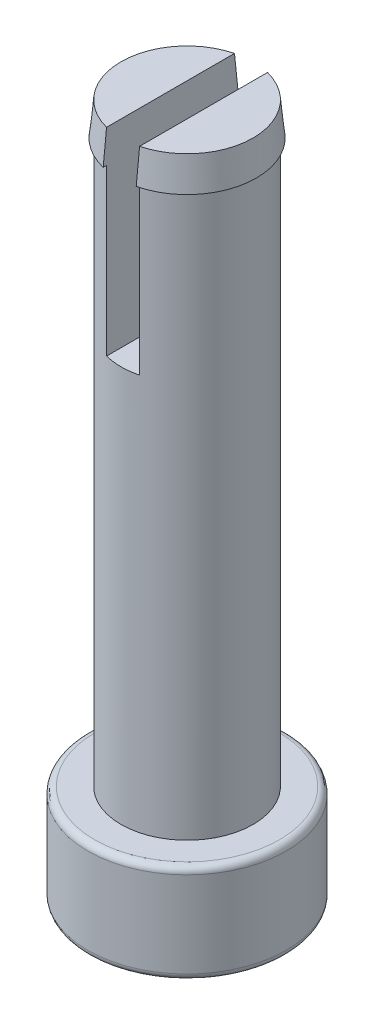
ISO-10303-21;
HEADER;
FILE_DESCRIPTION(('STEP AP214'),'2;1');
FILE_NAME('part.step','',(''),(''),'','','');
FILE_SCHEMA(('AUTOMOTIVE_DESIGN { 1 0 10303 214 1 1 1 1 }'));
ENDSEC;
DATA;
#1=APPLICATION_CONTEXT('core data for automotive mechanical design processes');
#2=APPLICATION_PROTOCOL_DEFINITION('international standard','automotive_design',2000,#1);
#3=PRODUCT_CONTEXT('',#1,'mechanical');
#4=PRODUCT('Part','Part','',(#3));
#5=PRODUCT_RELATED_PRODUCT_CATEGORY('part','',(#4));
#6=PRODUCT_DEFINITION_FORMATION('','',#4);
#7=PRODUCT_DEFINITION_CONTEXT('part definition',#1,'design');
#8=PRODUCT_DEFINITION('design','',#6,#7);
#9=PRODUCT_DEFINITION_SHAPE('','',#8);
#10=(LENGTH_UNIT() NAMED_UNIT(*) SI_UNIT(.MILLI.,.METRE.));
#11=(NAMED_UNIT(*) PLANE_ANGLE_UNIT() SI_UNIT($,.RADIAN.));
#12=(NAMED_UNIT(*) SI_UNIT($,.STERADIAN.) SOLID_ANGLE_UNIT());
#13=UNCERTAINTY_MEASURE_WITH_UNIT(LENGTH_MEASURE(1.E-05),#10,'distance_accuracy_value','');
#14=(GEOMETRIC_REPRESENTATION_CONTEXT(3) GLOBAL_UNCERTAINTY_ASSIGNED_CONTEXT((#13)) GLOBAL_UNIT_ASSIGNED_CONTEXT((#10,
#11,#12)) REPRESENTATION_CONTEXT('',''));
#15=CARTESIAN_POINT('',(0.,0.,0.));
#16=DIRECTION('',(0.,0.,1.));
#17=DIRECTION('',(1.,0.,0.));
#18=AXIS2_PLACEMENT_3D('',#15,#16,#17);
#19=CARTESIAN_POINT('',(-2.1,20.,0.));
#20=DIRECTION('',(0.,1.,0.));
#21=DIRECTION('',(0.,0.,1.));
#22=AXIS2_PLACEMENT_3D('',#19,#20,#21);
#23=PLANE('',#22);
#24=CARTESIAN_POINT('',(0.,20.,0.));
#25=DIRECTION('',(0.,-1.,0.));
#26=DIRECTION('',(0.,0.,-1.));
#27=AXIS2_PLACEMENT_3D('',#24,#25,#26);
#28=CIRCLE('',#27,2.1);
#29=CARTESIAN_POINT('',(0.499999999999999,20.,-2.03960780543711));
#30=VERTEX_POINT('',#29);
#31=CARTESIAN_POINT('',(0.5,20.,2.03960780543711));
#32=VERTEX_POINT('',#31);
#33=EDGE_CURVE('E118',#30,#32,#28,.T.);
#34=ORIENTED_EDGE('',*,*,#33,.T.);
#35=DIRECTION('',(0.,0.,-1.));
#36=VECTOR('',#35,1.);
#37=CARTESIAN_POINT('',(0.5,20.,0.));
#38=LINE('',#37,#36);
#39=CARTESIAN_POINT('',(0.5,20.,1.93649167310371));
#40=VERTEX_POINT('',#39);
#41=EDGE_CURVE('E196',#32,#40,#38,.T.);
#42=ORIENTED_EDGE('',*,*,#41,.T.);
#43=CARTESIAN_POINT('',(0.,20.,0.));
#44=DIRECTION('',(0.,1.,0.));
#45=DIRECTION('',(0.,0.,1.));
#46=AXIS2_PLACEMENT_3D('',#43,#44,#45);
#47=CIRCLE('',#46,2.);
#48=CARTESIAN_POINT('',(0.499999999999999,20.,-1.93649167310371));
#49=VERTEX_POINT('',#48);
#50=EDGE_CURVE('E105',#40,#49,#47,.T.);
#51=ORIENTED_EDGE('',*,*,#50,.T.);
#52=EDGE_CURVE('E57',#49,#30,#38,.T.);
#53=ORIENTED_EDGE('',*,*,#52,.T.);
#54=EDGE_LOOP('',(#34,#42,#51,#53));
#55=FACE_BOUND('',#54,.T.);
#56=ADVANCED_FACE('F34',(#55),#23,.F.);
#57=CARTESIAN_POINT('',(0.,21.,0.));
#58=DIRECTION('',(0.,-1.,0.));
#59=DIRECTION('',(0.,0.,-1.));
#60=AXIS2_PLACEMENT_3D('',#57,#58,#59);
#61=CONICAL_SURFACE('',#60,2.,0.0996686524911622);
#62=ORIENTED_EDGE('',*,*,#33,.F.);
#63=CARTESIAN_POINT('',(0.499999999999999,16.841130436013,-2.36357986666357));
#64=CARTESIAN_POINT('',(0.499999999999999,17.4581092019345,-2.30051294550379));
#65=CARTESIAN_POINT('',(0.499999999999999,18.075077794743,-2.23734624093098));
#66=CARTESIAN_POINT('',(0.499999999999999,19.3089863140136,-2.11073579129171));
#67=CARTESIAN_POINT('',(0.499999999999999,19.9259262404865,-2.04729204632903));
#68=CARTESIAN_POINT('',(0.499999999999999,21.1597696902874,-1.92004998262336));
#69=CARTESIAN_POINT('',(0.499999999999999,21.7766732136083,-1.85625166381081));
#70=CARTESIAN_POINT('',(0.499999999999999,23.0104289475399,-1.72815870123598));
#71=CARTESIAN_POINT('',(0.499999999999999,23.627281158131,-1.66386405728527));
#72=CARTESIAN_POINT('',(0.499999999999999,24.2441000838575,-1.59925039315231));
#73=B_SPLINE_CURVE_WITH_KNOTS('',3,(#63,#64,#65,#66,#67,#68,#69,#70,#71,#72),.UNSPECIFIED.,.F.,
.F.,(4,2,2,2,4),(0.,1.86058114819701,3.72116159936956,5.58174241557319,7.44232393822368),.UNSPECIFIED.);
#74=CARTESIAN_POINT('',(0.499999999999999,21.,-1.93649167310371));
#75=VERTEX_POINT('',#74);
#76=EDGE_CURVE('E194',#30,#75,#73,.T.);
#77=ORIENTED_EDGE('',*,*,#76,.T.);
#78=CARTESIAN_POINT('',(0.,21.,0.));
#79=DIRECTION('',(0.,-1.,0.));
#80=DIRECTION('',(0.,0.,-1.));
#81=AXIS2_PLACEMENT_3D('',#78,#79,#80);
#82=CIRCLE('',#81,2.);
#83=CARTESIAN_POINT('',(0.5,21.,1.93649167310371));
#84=VERTEX_POINT('',#83);
#85=EDGE_CURVE('E117',#75,#84,#82,.T.);
#86=ORIENTED_EDGE('',*,*,#85,.T.);
#87=CARTESIAN_POINT('',(0.5,24.2441000838575,1.59925039315231));
#88=CARTESIAN_POINT('',(0.5,23.2336599431167,1.70508949991539));
#89=CARTESIAN_POINT('',(0.5,22.2231318658387,1.81008354046585));
#90=CARTESIAN_POINT('',(0.5,20.9893168649101,1.93760388991941));
#91=CARTESIAN_POINT('',(0.5,20.766083590966,1.96064915154205));
#92=CARTESIAN_POINT('',(0.5,19.9259262174672,2.0472929739407));
#93=CARTESIAN_POINT('',(0.5,19.3089861080309,2.11073627491152));
#94=CARTESIAN_POINT('',(0.5,18.0750774821184,2.23734581002696));
#95=CARTESIAN_POINT('',(0.5,17.4581089656435,2.3005120441842));
#96=CARTESIAN_POINT('',(0.5,16.841130436013,2.36357986666357));
#97=B_SPLINE_CURVE_WITH_KNOTS('',3,(#87,#88,#89,#90,#91,#92,#93,#94,#95,#96),.UNSPECIFIED.,.F.,
.F.,(4,2,2,2,4),(0.,3.04790325494798,3.7211621941506,5.58174303628262,7.44232379352003),.UNSPECIFIED.);
#98=EDGE_CURVE('E215',#84,#32,#97,.T.);
#99=ORIENTED_EDGE('',*,*,#98,.T.);
#100=EDGE_LOOP('',(#62,#77,#86,#99));
#101=FACE_BOUND('',#100,.T.);
#102=ADVANCED_FACE('F166',(#101),#61,.T.);
#103=CARTESIAN_POINT('',(0.,21.,0.));
#104=DIRECTION('',(0.,1.,0.));
#105=DIRECTION('',(0.,0.,1.));
#106=AXIS2_PLACEMENT_3D('',#103,#104,#105);
#107=PLANE('',#106);
#108=DIRECTION('',(0.,0.,-1.));
#109=VECTOR('',#108,1.);
#110=CARTESIAN_POINT('',(0.5,21.,0.));
#111=LINE('',#110,#109);
#112=EDGE_CURVE('E104',#84,#75,#111,.T.);
#113=ORIENTED_EDGE('',*,*,#112,.F.);
#114=ORIENTED_EDGE('',*,*,#85,.F.);
#115=EDGE_LOOP('',(#113,#114));
#116=FACE_BOUND('',#115,.T.);
#117=ADVANCED_FACE('F160',(#116),#107,.T.);
#118=CARTESIAN_POINT('',(0.,21.,0.));
#119=DIRECTION('',(0.,-1.,0.));
#120=DIRECTION('',(0.,0.,-1.));
#121=AXIS2_PLACEMENT_3D('',#118,#119,#120);
#122=CYLINDRICAL_SURFACE('',#121,2.);
#123=ORIENTED_EDGE('',*,*,#50,.F.);
#124=DIRECTION('',(0.,-1.,0.));
#125=VECTOR('',#124,1.);
#126=CARTESIAN_POINT('',(0.5,21.,1.93649167310371));
#127=LINE('',#126,#125);
#128=CARTESIAN_POINT('',(0.5,15.,1.93649167310371));
#129=VERTEX_POINT('',#128);
#130=EDGE_CURVE('E204',#40,#129,#127,.T.);
#131=ORIENTED_EDGE('',*,*,#130,.T.);
#132=CARTESIAN_POINT('',(0.,15.,0.));
#133=DIRECTION('',(0.,-1.,0.));
#134=DIRECTION('',(0.,0.,-1.));
#135=AXIS2_PLACEMENT_3D('',#132,#133,#134);
#136=CIRCLE('',#135,2.);
#137=CARTESIAN_POINT('',(-0.5,15.,1.93649167310371));
#138=VERTEX_POINT('',#137);
#139=EDGE_CURVE('E135',#129,#138,#136,.T.);
#140=ORIENTED_EDGE('',*,*,#139,.T.);
#141=DIRECTION('',(0.,-1.,0.));
#142=VECTOR('',#141,1.);
#143=CARTESIAN_POINT('',(-0.5,21.,1.93649167310371));
#144=LINE('',#143,#142);
#145=CARTESIAN_POINT('',(-0.5,20.,1.93649167310371));
#146=VERTEX_POINT('',#145);
#147=EDGE_CURVE('E241',#138,#146,#144,.F.);
#148=ORIENTED_EDGE('',*,*,#147,.T.);
#149=CARTESIAN_POINT('',(-0.5,20.,-1.93649167310371));
#150=VERTEX_POINT('',#149);
#151=EDGE_CURVE('E128',#150,#146,#47,.T.);
#152=ORIENTED_EDGE('',*,*,#151,.F.);
#153=DIRECTION('',(0.,-1.,0.));
#154=VECTOR('',#153,1.);
#155=CARTESIAN_POINT('',(-0.5,21.,-1.93649167310371));
#156=LINE('',#155,#154);
#157=CARTESIAN_POINT('',(-0.5,15.,-1.93649167310371));
#158=VERTEX_POINT('',#157);
#159=EDGE_CURVE('E222',#150,#158,#156,.T.);
#160=ORIENTED_EDGE('',*,*,#159,.T.);
#161=CARTESIAN_POINT('',(0.499999999999999,15.,-1.93649167310371));
#162=VERTEX_POINT('',#161);
#163=EDGE_CURVE('E132',#158,#162,#136,.T.);
#164=ORIENTED_EDGE('',*,*,#163,.T.);
#165=DIRECTION('',(0.,-1.,0.));
#166=VECTOR('',#165,1.);
#167=CARTESIAN_POINT('',(0.499999999999999,21.,-1.93649167310371));
#168=LINE('',#167,#166);
#169=EDGE_CURVE('E193',#162,#49,#168,.F.);
#170=ORIENTED_EDGE('',*,*,#169,.T.);
#171=EDGE_LOOP('',(#123,#131,#140,#148,#152,#160,#164,#170));
#172=FACE_BOUND('',#171,.T.);
#173=CARTESIAN_POINT('',(0.,3.,0.));
#174=DIRECTION('',(0.,1.,0.));
#175=DIRECTION('',(0.,0.,1.));
#176=AXIS2_PLACEMENT_3D('',#173,#174,#175);
#177=CIRCLE('',#176,2.);
#178=CARTESIAN_POINT('',(0.,3.,2.));
#179=VERTEX_POINT('',#178);
#180=EDGE_CURVE('E121',#179,#179,#177,.T.);
#181=ORIENTED_EDGE('',*,*,#180,.T.);
#182=EDGE_LOOP('',(#181));
#183=FACE_BOUND('',#182,.T.);
#184=ADVANCED_FACE('F155',(#172,#183),#122,.T.);
#185=CARTESIAN_POINT('',(0.,3.,0.));
#186=DIRECTION('',(0.,1.,0.));
#187=DIRECTION('',(0.,0.,1.));
#188=AXIS2_PLACEMENT_3D('',#185,#186,#187);
#189=PLANE('',#188);
#190=CARTESIAN_POINT('',(0.,3.,0.));
#191=DIRECTION('',(0.,1.,0.));
#192=DIRECTION('',(0.,0.,1.));
#193=AXIS2_PLACEMENT_3D('',#190,#191,#192);
#194=CIRCLE('',#193,2.8);
#195=CARTESIAN_POINT('',(0.,3.,2.8));
#196=VERTEX_POINT('',#195);
#197=EDGE_CURVE('E136',#196,#196,#194,.T.);
#198=ORIENTED_EDGE('',*,*,#197,.T.);
#199=EDGE_LOOP('',(#198));
#200=FACE_BOUND('',#199,.T.);
#201=ORIENTED_EDGE('',*,*,#180,.F.);
#202=EDGE_LOOP('',(#201));
#203=FACE_BOUND('',#202,.T.);
#204=ADVANCED_FACE('F152',(#200,#203),#189,.T.);
#205=CARTESIAN_POINT('',(0.,3.,0.));
#206=DIRECTION('',(0.,-1.,0.));
#207=DIRECTION('',(0.,0.,-1.));
#208=AXIS2_PLACEMENT_3D('',#205,#206,#207);
#209=CYLINDRICAL_SURFACE('',#208,3.);
#210=CARTESIAN_POINT('',(0.,2.8,0.));
#211=DIRECTION('',(0.,1.,0.));
#212=DIRECTION('',(0.,0.,1.));
#213=AXIS2_PLACEMENT_3D('',#210,#211,#212);
#214=CIRCLE('',#213,3.);
#215=CARTESIAN_POINT('',(0.,2.8,3.));
#216=VERTEX_POINT('',#215);
#217=EDGE_CURVE('E42',#216,#216,#214,.F.);
#218=ORIENTED_EDGE('',*,*,#217,.T.);
#219=EDGE_LOOP('',(#218));
#220=FACE_BOUND('',#219,.T.);
#221=CARTESIAN_POINT('',(0.,0.2,0.));
#222=DIRECTION('',(0.,1.,0.));
#223=DIRECTION('',(0.,0.,1.));
#224=AXIS2_PLACEMENT_3D('',#221,#222,#223);
#225=CIRCLE('',#224,3.);
#226=CARTESIAN_POINT('',(0.,0.2,3.));
#227=VERTEX_POINT('',#226);
#228=EDGE_CURVE('E139',#227,#227,#225,.T.);
#229=ORIENTED_EDGE('',*,*,#228,.T.);
#230=EDGE_LOOP('',(#229));
#231=FACE_BOUND('',#230,.T.);
#232=ADVANCED_FACE('F144',(#220,#231),#209,.T.);
#233=CARTESIAN_POINT('',(0.,0.,0.));
#234=DIRECTION('',(0.,1.,0.));
#235=DIRECTION('',(0.,0.,1.));
#236=AXIS2_PLACEMENT_3D('',#233,#234,#235);
#237=PLANE('',#236);
#238=CARTESIAN_POINT('',(0.,0.,0.));
#239=DIRECTION('',(0.,1.,0.));
#240=DIRECTION('',(0.,0.,1.));
#241=AXIS2_PLACEMENT_3D('',#238,#239,#240);
#242=CIRCLE('',#241,2.8);
#243=CARTESIAN_POINT('',(0.,0.,2.8));
#244=VERTEX_POINT('',#243);
#245=EDGE_CURVE('E11',#244,#244,#242,.F.);
#246=ORIENTED_EDGE('',*,*,#245,.T.);
#247=EDGE_LOOP('',(#246));
#248=FACE_BOUND('',#247,.T.);
#249=ADVANCED_FACE('F181',(#248),#237,.F.);
#250=CARTESIAN_POINT('',(-0.5,20.,2.03960780543711));
#251=VERTEX_POINT('',#250);
#252=CARTESIAN_POINT('',(-0.5,20.,-2.03960780543711));
#253=VERTEX_POINT('',#252);
#254=EDGE_CURVE('E112',#251,#253,#28,.T.);
#255=ORIENTED_EDGE('',*,*,#254,.T.);
#256=DIRECTION('',(0.,0.,1.));
#257=VECTOR('',#256,1.);
#258=CARTESIAN_POINT('',(-0.5,20.,0.));
#259=LINE('',#258,#257);
#260=EDGE_CURVE('E191',#253,#150,#259,.T.);
#261=ORIENTED_EDGE('',*,*,#260,.T.);
#262=ORIENTED_EDGE('',*,*,#151,.T.);
#263=EDGE_CURVE('E113',#146,#251,#259,.T.);
#264=ORIENTED_EDGE('',*,*,#263,.T.);
#265=EDGE_LOOP('',(#255,#261,#262,#264));
#266=FACE_BOUND('',#265,.T.);
#267=ADVANCED_FACE('F173',(#266),#23,.F.);
#268=CARTESIAN_POINT('',(-0.5,21.,1.93649167310371));
#269=VERTEX_POINT('',#268);
#270=CARTESIAN_POINT('',(-0.5,21.,-1.93649167310371));
#271=VERTEX_POINT('',#270);
#272=EDGE_CURVE('E110',#269,#271,#82,.T.);
#273=ORIENTED_EDGE('',*,*,#272,.T.);
#274=CARTESIAN_POINT('',(-0.5,24.2441000838575,-1.59925039315231));
#275=CARTESIAN_POINT('',(-0.5,23.2336599431167,-1.70508949991539));
#276=CARTESIAN_POINT('',(-0.5,22.2231318658387,-1.81008354046585));
#277=CARTESIAN_POINT('',(-0.5,20.9893168649101,-1.93760388991941));
#278=CARTESIAN_POINT('',(-0.5,20.766083590966,-1.96064915154205));
#279=CARTESIAN_POINT('',(-0.5,19.9259262174672,-2.0472929739407));
#280=CARTESIAN_POINT('',(-0.5,19.3089861080309,-2.11073627491152));
#281=CARTESIAN_POINT('',(-0.5,18.0750774821184,-2.23734581002695));
#282=CARTESIAN_POINT('',(-0.5,17.4581089656435,-2.3005120441842));
#283=CARTESIAN_POINT('',(-0.5,16.841130436013,-2.36357986666357));
#284=B_SPLINE_CURVE_WITH_KNOTS('',3,(#274,#275,#276,#277,#278,#279,#280,#281,#282,#283),
.UNSPECIFIED.,.F.,.F.,(4,2,2,2,4),(0.,3.04790325494798,3.7211621941506,5.58174303628262,
7.44232379352003),.UNSPECIFIED.);
#285=EDGE_CURVE('E49',#271,#253,#284,.T.);
#286=ORIENTED_EDGE('',*,*,#285,.T.);
#287=ORIENTED_EDGE('',*,*,#254,.F.);
#288=CARTESIAN_POINT('',(-0.5,16.841130436013,2.36357986666357));
#289=CARTESIAN_POINT('',(-0.5,17.4581092019345,2.30051294550379));
#290=CARTESIAN_POINT('',(-0.5,18.075077794743,2.23734624093098));
#291=CARTESIAN_POINT('',(-0.5,19.3089863140136,2.11073579129171));
#292=CARTESIAN_POINT('',(-0.5,19.9259262404865,2.04729204632903));
#293=CARTESIAN_POINT('',(-0.5,21.1597696902874,1.92004998262336));
#294=CARTESIAN_POINT('',(-0.5,21.7766732136083,1.85625166381081));
#295=CARTESIAN_POINT('',(-0.5,23.0104289475399,1.72815870123598));
#296=CARTESIAN_POINT('',(-0.5,23.627281158131,1.66386405728527));
#297=CARTESIAN_POINT('',(-0.5,24.2441000838575,1.59925039315231));
#298=B_SPLINE_CURVE_WITH_KNOTS('',3,(#288,#289,#290,#291,#292,#293,#294,#295,#296,#297),
.UNSPECIFIED.,.F.,.F.,(4,2,2,2,4),(0.,1.86058114819701,3.72116159936956,5.58174241557319,
7.44232393822368),.UNSPECIFIED.);
#299=EDGE_CURVE('E99',#251,#269,#298,.T.);
#300=ORIENTED_EDGE('',*,*,#299,.T.);
#301=EDGE_LOOP('',(#273,#286,#287,#300));
#302=FACE_BOUND('',#301,.T.);
#303=ADVANCED_FACE('F109',(#302),#61,.T.);
#304=DIRECTION('',(0.,0.,1.));
#305=VECTOR('',#304,1.);
#306=CARTESIAN_POINT('',(-0.5,21.,0.));
#307=LINE('',#306,#305);
#308=EDGE_CURVE('E96',#271,#269,#307,.T.);
#309=ORIENTED_EDGE('',*,*,#308,.F.);
#310=ORIENTED_EDGE('',*,*,#272,.F.);
#311=EDGE_LOOP('',(#309,#310));
#312=FACE_BOUND('',#311,.T.);
#313=ADVANCED_FACE('F116',(#312),#107,.T.);
#314=CARTESIAN_POINT('',(0.,15.,0.));
#315=DIRECTION('',(0.,-1.,0.));
#316=DIRECTION('',(0.,0.,-1.));
#317=AXIS2_PLACEMENT_3D('',#314,#315,#316);
#318=PLANE('',#317);
#319=DIRECTION('',(0.,0.,-1.));
#320=VECTOR('',#319,1.);
#321=CARTESIAN_POINT('',(0.499999999999999,15.,-2.46882278638811));
#322=LINE('',#321,#320);
#323=EDGE_CURVE('E230',#129,#162,#322,.T.);
#324=ORIENTED_EDGE('',*,*,#323,.T.);
#325=ORIENTED_EDGE('',*,*,#163,.F.);
#326=DIRECTION('',(0.,0.,1.));
#327=VECTOR('',#326,1.);
#328=CARTESIAN_POINT('',(-0.5,15.,-2.46882278638811));
#329=LINE('',#328,#327);
#330=EDGE_CURVE('E114',#158,#138,#329,.T.);
#331=ORIENTED_EDGE('',*,*,#330,.T.);
#332=ORIENTED_EDGE('',*,*,#139,.F.);
#333=EDGE_LOOP('',(#324,#325,#331,#332));
#334=FACE_BOUND('',#333,.T.);
#335=ADVANCED_FACE('F210',(#334),#318,.F.);
#336=CARTESIAN_POINT('',(0.499999999999999,15.,-2.46882278638811));
#337=DIRECTION('',(1.,0.,0.));
#338=DIRECTION('',(0.,0.,-1.));
#339=AXIS2_PLACEMENT_3D('',#336,#337,#338);
#340=PLANE('',#339);
#341=ORIENTED_EDGE('',*,*,#323,.F.);
#342=ORIENTED_EDGE('',*,*,#130,.F.);
#343=ORIENTED_EDGE('',*,*,#41,.F.);
#344=ORIENTED_EDGE('',*,*,#98,.F.);
#345=ORIENTED_EDGE('',*,*,#112,.T.);
#346=ORIENTED_EDGE('',*,*,#76,.F.);
#347=ORIENTED_EDGE('',*,*,#52,.F.);
#348=ORIENTED_EDGE('',*,*,#169,.F.);
#349=EDGE_LOOP('',(#341,#342,#343,#344,#345,#346,#347,#348));
#350=FACE_BOUND('',#349,.T.);
#351=ADVANCED_FACE('F206',(#350),#340,.F.);
#352=CARTESIAN_POINT('',(-0.5,15.,-2.46882278638811));
#353=DIRECTION('',(-1.,0.,0.));
#354=DIRECTION('',(0.,0.,1.));
#355=AXIS2_PLACEMENT_3D('',#352,#353,#354);
#356=PLANE('',#355);
#357=ORIENTED_EDGE('',*,*,#260,.F.);
#358=ORIENTED_EDGE('',*,*,#285,.F.);
#359=ORIENTED_EDGE('',*,*,#308,.T.);
#360=ORIENTED_EDGE('',*,*,#299,.F.);
#361=ORIENTED_EDGE('',*,*,#263,.F.);
#362=ORIENTED_EDGE('',*,*,#147,.F.);
#363=ORIENTED_EDGE('',*,*,#330,.F.);
#364=ORIENTED_EDGE('',*,*,#159,.F.);
#365=EDGE_LOOP('',(#357,#358,#359,#360,#361,#362,#363,#364));
#366=FACE_BOUND('',#365,.T.);
#367=ADVANCED_FACE('F98',(#366),#356,.F.);
#368=CARTESIAN_POINT('',(0.,2.8,0.));
#369=DIRECTION('',(0.,1.,0.));
#370=DIRECTION('',(0.,0.,1.));
#371=AXIS2_PLACEMENT_3D('',#368,#369,#370);
#372=TOROIDAL_SURFACE('',#371,2.8,0.2);
#373=ORIENTED_EDGE('',*,*,#217,.F.);
#374=EDGE_LOOP('',(#373));
#375=FACE_BOUND('',#374,.T.);
#376=ORIENTED_EDGE('',*,*,#197,.F.);
#377=EDGE_LOOP('',(#376));
#378=FACE_BOUND('',#377,.T.);
#379=ADVANCED_FACE('F147',(#375,#378),#372,.T.);
#380=CARTESIAN_POINT('',(0.,0.2,0.));
#381=DIRECTION('',(0.,1.,0.));
#382=DIRECTION('',(0.,0.,1.));
#383=AXIS2_PLACEMENT_3D('',#380,#381,#382);
#384=TOROIDAL_SURFACE('',#383,2.8,0.2);
#385=ORIENTED_EDGE('',*,*,#245,.F.);
#386=EDGE_LOOP('',(#385));
#387=FACE_BOUND('',#386,.T.);
#388=ORIENTED_EDGE('',*,*,#228,.F.);
#389=EDGE_LOOP('',(#388));
#390=FACE_BOUND('',#389,.T.);
#391=ADVANCED_FACE('F36',(#387,#390),#384,.T.);
#392=CLOSED_SHELL('',(#56,#102,#117,#184,#204,#232,#249,#267,#303,#313,#335,#351,#367,#379,#391));
#393=MANIFOLD_SOLID_BREP('B2',#392);
#394=ADVANCED_BREP_SHAPE_REPRESENTATION('',(#18,#393),#14);
#395=SHAPE_DEFINITION_REPRESENTATION(#9,#394);
ENDSEC;
END-ISO-10303-21;
